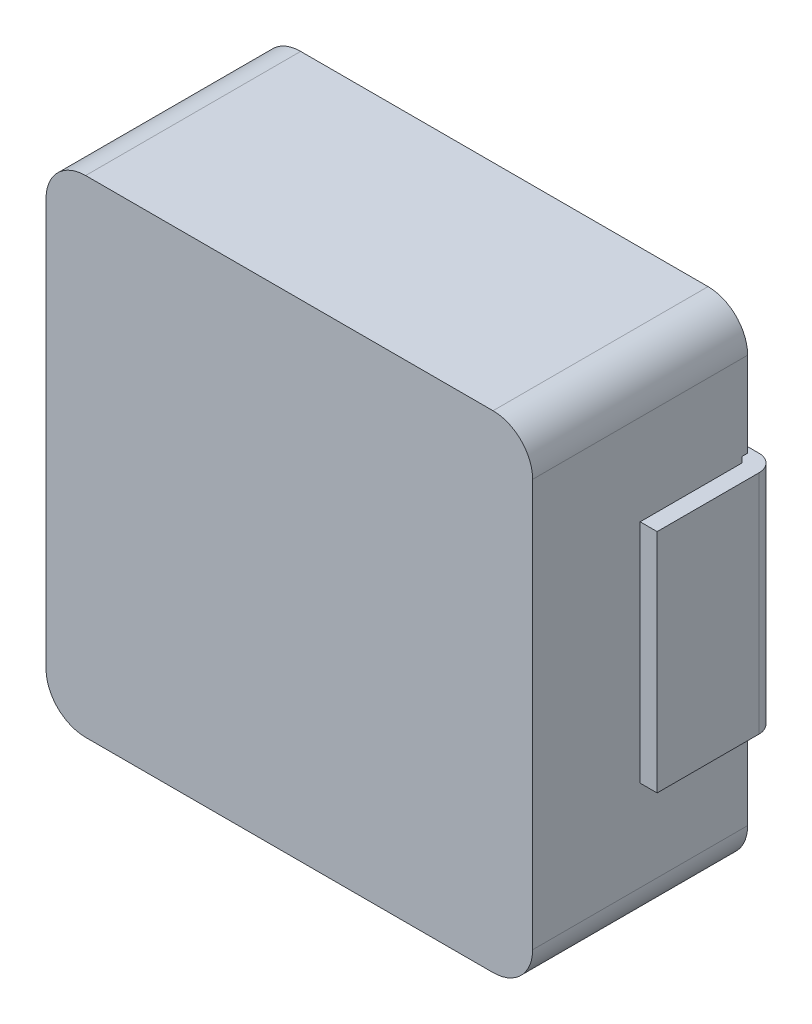
ISO-10303-21;
HEADER;
FILE_DESCRIPTION(('STEP AP214'),'2;1');
FILE_NAME('part.step','',(''),(''),'','','');
FILE_SCHEMA(('AUTOMOTIVE_DESIGN { 1 0 10303 214 1 1 1 1 }'));
ENDSEC;
DATA;
#1=APPLICATION_CONTEXT('core data for automotive mechanical design processes');
#2=APPLICATION_PROTOCOL_DEFINITION('international standard','automotive_design',2000,#1);
#3=PRODUCT_CONTEXT('',#1,'mechanical');
#4=PRODUCT('Part','Part','',(#3));
#5=PRODUCT_RELATED_PRODUCT_CATEGORY('part','',(#4));
#6=PRODUCT_DEFINITION_FORMATION('','',#4);
#7=PRODUCT_DEFINITION_CONTEXT('part definition',#1,'design');
#8=PRODUCT_DEFINITION('design','',#6,#7);
#9=PRODUCT_DEFINITION_SHAPE('','',#8);
#10=(LENGTH_UNIT() NAMED_UNIT(*) SI_UNIT(.MILLI.,.METRE.));
#11=(NAMED_UNIT(*) PLANE_ANGLE_UNIT() SI_UNIT($,.RADIAN.));
#12=(NAMED_UNIT(*) SI_UNIT($,.STERADIAN.) SOLID_ANGLE_UNIT());
#13=UNCERTAINTY_MEASURE_WITH_UNIT(LENGTH_MEASURE(1.E-05),#10,'distance_accuracy_value','');
#14=(GEOMETRIC_REPRESENTATION_CONTEXT(3) GLOBAL_UNCERTAINTY_ASSIGNED_CONTEXT((#13)) GLOBAL_UNIT_ASSIGNED_CONTEXT((#10,
#11,#12)) REPRESENTATION_CONTEXT('',''));
#15=CARTESIAN_POINT('',(0.,0.,0.));
#16=DIRECTION('',(0.,0.,1.));
#17=DIRECTION('',(1.,0.,0.));
#18=AXIS2_PLACEMENT_3D('',#15,#16,#17);
#19=CARTESIAN_POINT('',(2.15,2.15,1.9));
#20=DIRECTION('',(-1.,0.,0.));
#21=DIRECTION('',(0.,-1.,0.));
#22=AXIS2_PLACEMENT_3D('',#19,#20,#21);
#23=PLANE('',#22);
#24=DIRECTION('',(0.,0.,-1.));
#25=VECTOR('',#24,1.);
#26=CARTESIAN_POINT('',(2.15,1.,0.95));
#27=LINE('',#26,#25);
#28=CARTESIAN_POINT('',(2.15,1.,0.95));
#29=VERTEX_POINT('',#28);
#30=CARTESIAN_POINT('',(2.15,1.,0.05));
#31=VERTEX_POINT('',#30);
#32=EDGE_CURVE('E253',#29,#31,#27,.T.);
#33=ORIENTED_EDGE('',*,*,#32,.T.);
#34=DIRECTION('',(0.,-1.,0.));
#35=VECTOR('',#34,1.);
#36=CARTESIAN_POINT('',(2.15,-1.05,0.05));
#37=LINE('',#36,#35);
#38=CARTESIAN_POINT('',(2.15,1.05,0.05));
#39=VERTEX_POINT('',#38);
#40=EDGE_CURVE('E398',#39,#31,#37,.T.);
#41=ORIENTED_EDGE('',*,*,#40,.F.);
#42=DIRECTION('',(0.,0.,-1.));
#43=VECTOR('',#42,1.);
#44=CARTESIAN_POINT('',(2.15,1.05,0.05));
#45=LINE('',#44,#43);
#46=CARTESIAN_POINT('',(2.15,1.05,0.));
#47=VERTEX_POINT('',#46);
#48=EDGE_CURVE('E378',#39,#47,#45,.T.);
#49=ORIENTED_EDGE('',*,*,#48,.T.);
#50=DIRECTION('',(0.,1.,0.));
#51=VECTOR('',#50,1.);
#52=CARTESIAN_POINT('',(2.15,2.15,0.));
#53=LINE('',#52,#51);
#54=CARTESIAN_POINT('',(2.15,1.8,0.));
#55=VERTEX_POINT('',#54);
#56=EDGE_CURVE('E389',#47,#55,#53,.T.);
#57=ORIENTED_EDGE('',*,*,#56,.T.);
#58=DIRECTION('',(0.,0.,-1.));
#59=VECTOR('',#58,1.);
#60=CARTESIAN_POINT('',(2.15,1.8,1.9));
#61=LINE('',#60,#59);
#62=CARTESIAN_POINT('',(2.15,1.8,1.9));
#63=VERTEX_POINT('',#62);
#64=EDGE_CURVE('E495',#55,#63,#61,.F.);
#65=ORIENTED_EDGE('',*,*,#64,.T.);
#66=DIRECTION('',(0.,1.,0.));
#67=VECTOR('',#66,1.);
#68=CARTESIAN_POINT('',(2.15,2.15,1.9));
#69=LINE('',#68,#67);
#70=CARTESIAN_POINT('',(2.15,-1.8,1.9));
#71=VERTEX_POINT('',#70);
#72=EDGE_CURVE('E437',#71,#63,#69,.T.);
#73=ORIENTED_EDGE('',*,*,#72,.F.);
#74=DIRECTION('',(0.,0.,-1.));
#75=VECTOR('',#74,1.);
#76=CARTESIAN_POINT('',(2.15,-1.8,1.9));
#77=LINE('',#76,#75);
#78=CARTESIAN_POINT('',(2.15,-1.8,0.));
#79=VERTEX_POINT('',#78);
#80=EDGE_CURVE('E491',#71,#79,#77,.T.);
#81=ORIENTED_EDGE('',*,*,#80,.T.);
#82=CARTESIAN_POINT('',(2.15,-1.05,0.));
#83=VERTEX_POINT('',#82);
#84=EDGE_CURVE('E455',#79,#83,#53,.T.);
#85=ORIENTED_EDGE('',*,*,#84,.T.);
#86=DIRECTION('',(0.,0.,-1.));
#87=VECTOR('',#86,1.);
#88=CARTESIAN_POINT('',(2.15,-1.05,0.05));
#89=LINE('',#88,#87);
#90=CARTESIAN_POINT('',(2.15,-1.05,0.05));
#91=VERTEX_POINT('',#90);
#92=EDGE_CURVE('E415',#91,#83,#89,.T.);
#93=ORIENTED_EDGE('',*,*,#92,.F.);
#94=CARTESIAN_POINT('',(2.15,-1.,0.05));
#95=VERTEX_POINT('',#94);
#96=EDGE_CURVE('E403',#95,#91,#37,.T.);
#97=ORIENTED_EDGE('',*,*,#96,.F.);
#98=DIRECTION('',(0.,0.,-1.));
#99=VECTOR('',#98,1.);
#100=CARTESIAN_POINT('',(2.15,-1.,0.95));
#101=LINE('',#100,#99);
#102=CARTESIAN_POINT('',(2.15,-1.,0.95));
#103=VERTEX_POINT('',#102);
#104=EDGE_CURVE('E270',#103,#95,#101,.T.);
#105=ORIENTED_EDGE('',*,*,#104,.F.);
#106=DIRECTION('',(0.,-1.,0.));
#107=VECTOR('',#106,1.);
#108=CARTESIAN_POINT('',(2.15,-1.,0.95));
#109=LINE('',#108,#107);
#110=EDGE_CURVE('E257',#29,#103,#109,.T.);
#111=ORIENTED_EDGE('',*,*,#110,.F.);
#112=EDGE_LOOP('',(#33,#41,#49,#57,#65,#73,#81,#85,#93,#97,#105,#111));
#113=FACE_BOUND('',#112,.T.);
#114=ADVANCED_FACE('F39',(#113),#23,.F.);
#115=CARTESIAN_POINT('',(-2.15,2.15,1.9));
#116=DIRECTION('',(1.,0.,0.));
#117=DIRECTION('',(0.,1.,0.));
#118=AXIS2_PLACEMENT_3D('',#115,#116,#117);
#119=PLANE('',#118);
#120=DIRECTION('',(0.,0.,-1.));
#121=VECTOR('',#120,1.);
#122=CARTESIAN_POINT('',(-2.15,-1.,0.95));
#123=LINE('',#122,#121);
#124=CARTESIAN_POINT('',(-2.15,-1.,0.95));
#125=VERTEX_POINT('',#124);
#126=CARTESIAN_POINT('',(-2.15,-1.,0.05));
#127=VERTEX_POINT('',#126);
#128=EDGE_CURVE('E292',#125,#127,#123,.T.);
#129=ORIENTED_EDGE('',*,*,#128,.T.);
#130=DIRECTION('',(0.,1.,0.));
#131=VECTOR('',#130,1.);
#132=CARTESIAN_POINT('',(-2.15,-1.05,0.05));
#133=LINE('',#132,#131);
#134=CARTESIAN_POINT('',(-2.15,-1.05,0.05));
#135=VERTEX_POINT('',#134);
#136=EDGE_CURVE('E355',#135,#127,#133,.T.);
#137=ORIENTED_EDGE('',*,*,#136,.F.);
#138=DIRECTION('',(0.,0.,-1.));
#139=VECTOR('',#138,1.);
#140=CARTESIAN_POINT('',(-2.15,-1.05,0.05));
#141=LINE('',#140,#139);
#142=CARTESIAN_POINT('',(-2.15,-1.05,0.));
#143=VERTEX_POINT('',#142);
#144=EDGE_CURVE('E385',#135,#143,#141,.T.);
#145=ORIENTED_EDGE('',*,*,#144,.T.);
#146=DIRECTION('',(0.,-1.,0.));
#147=VECTOR('',#146,1.);
#148=CARTESIAN_POINT('',(-2.15,2.15,0.));
#149=LINE('',#148,#147);
#150=CARTESIAN_POINT('',(-2.15,-1.8,0.));
#151=VERTEX_POINT('',#150);
#152=EDGE_CURVE('E463',#143,#151,#149,.T.);
#153=ORIENTED_EDGE('',*,*,#152,.T.);
#154=DIRECTION('',(0.,0.,-1.));
#155=VECTOR('',#154,1.);
#156=CARTESIAN_POINT('',(-2.15,-1.8,1.9));
#157=LINE('',#156,#155);
#158=CARTESIAN_POINT('',(-2.15,-1.8,1.9));
#159=VERTEX_POINT('',#158);
#160=EDGE_CURVE('E510',#151,#159,#157,.F.);
#161=ORIENTED_EDGE('',*,*,#160,.T.);
#162=DIRECTION('',(0.,-1.,0.));
#163=VECTOR('',#162,1.);
#164=CARTESIAN_POINT('',(-2.15,2.15,1.9));
#165=LINE('',#164,#163);
#166=CARTESIAN_POINT('',(-2.15,1.8,1.9));
#167=VERTEX_POINT('',#166);
#168=EDGE_CURVE('E446',#167,#159,#165,.T.);
#169=ORIENTED_EDGE('',*,*,#168,.F.);
#170=DIRECTION('',(0.,0.,-1.));
#171=VECTOR('',#170,1.);
#172=CARTESIAN_POINT('',(-2.15,1.8,1.9));
#173=LINE('',#172,#171);
#174=CARTESIAN_POINT('',(-2.15,1.8,0.));
#175=VERTEX_POINT('',#174);
#176=EDGE_CURVE('E513',#167,#175,#173,.T.);
#177=ORIENTED_EDGE('',*,*,#176,.T.);
#178=CARTESIAN_POINT('',(-2.15,1.05,0.));
#179=VERTEX_POINT('',#178);
#180=EDGE_CURVE('E464',#175,#179,#149,.T.);
#181=ORIENTED_EDGE('',*,*,#180,.T.);
#182=DIRECTION('',(0.,0.,-1.));
#183=VECTOR('',#182,1.);
#184=CARTESIAN_POINT('',(-2.15,1.05,0.05));
#185=LINE('',#184,#183);
#186=CARTESIAN_POINT('',(-2.15,1.05,0.05));
#187=VERTEX_POINT('',#186);
#188=EDGE_CURVE('E372',#187,#179,#185,.T.);
#189=ORIENTED_EDGE('',*,*,#188,.F.);
#190=CARTESIAN_POINT('',(-2.15,1.,0.05));
#191=VERTEX_POINT('',#190);
#192=EDGE_CURVE('E360',#191,#187,#133,.T.);
#193=ORIENTED_EDGE('',*,*,#192,.F.);
#194=DIRECTION('',(0.,0.,-1.));
#195=VECTOR('',#194,1.);
#196=CARTESIAN_POINT('',(-2.15,1.,0.95));
#197=LINE('',#196,#195);
#198=CARTESIAN_POINT('',(-2.15,1.,0.95));
#199=VERTEX_POINT('',#198);
#200=EDGE_CURVE('E289',#199,#191,#197,.T.);
#201=ORIENTED_EDGE('',*,*,#200,.F.);
#202=DIRECTION('',(0.,1.,0.));
#203=VECTOR('',#202,1.);
#204=CARTESIAN_POINT('',(-2.15,-1.,0.95));
#205=LINE('',#204,#203);
#206=EDGE_CURVE('E282',#125,#199,#205,.T.);
#207=ORIENTED_EDGE('',*,*,#206,.F.);
#208=EDGE_LOOP('',(#129,#137,#145,#153,#161,#169,#177,#181,#189,#193,#201,#207));
#209=FACE_BOUND('',#208,.T.);
#210=ADVANCED_FACE('F606',(#209),#119,.F.);
#211=CARTESIAN_POINT('',(0.,0.,0.05));
#212=DIRECTION('',(0.,0.,1.));
#213=DIRECTION('',(1.,0.,0.));
#214=AXIS2_PLACEMENT_3D('',#211,#212,#213);
#215=PLANE('',#214);
#216=DIRECTION('',(1.,0.,0.));
#217=VECTOR('',#216,1.);
#218=CARTESIAN_POINT('',(1.3,1.,0.05));
#219=LINE('',#218,#217);
#220=CARTESIAN_POINT('',(1.3,1.,0.05));
#221=VERTEX_POINT('',#220);
#222=EDGE_CURVE('E301',#221,#31,#219,.T.);
#223=ORIENTED_EDGE('',*,*,#222,.F.);
#224=DIRECTION('',(0.,1.,0.));
#225=VECTOR('',#224,1.);
#226=CARTESIAN_POINT('',(1.3,-1.,0.05));
#227=LINE('',#226,#225);
#228=CARTESIAN_POINT('',(1.3,-1.,0.05));
#229=VERTEX_POINT('',#228);
#230=EDGE_CURVE('E295',#229,#221,#227,.T.);
#231=ORIENTED_EDGE('',*,*,#230,.F.);
#232=DIRECTION('',(-1.,0.,0.));
#233=VECTOR('',#232,1.);
#234=CARTESIAN_POINT('',(0.,-1.,0.05));
#235=LINE('',#234,#233);
#236=EDGE_CURVE('E528',#95,#229,#235,.T.);
#237=ORIENTED_EDGE('',*,*,#236,.F.);
#238=ORIENTED_EDGE('',*,*,#96,.T.);
#239=DIRECTION('',(-1.,0.,0.));
#240=VECTOR('',#239,1.);
#241=CARTESIAN_POINT('',(2.15,-1.05,0.05));
#242=LINE('',#241,#240);
#243=CARTESIAN_POINT('',(1.25,-1.05,0.05));
#244=VERTEX_POINT('',#243);
#245=EDGE_CURVE('E402',#91,#244,#242,.T.);
#246=ORIENTED_EDGE('',*,*,#245,.T.);
#247=DIRECTION('',(0.,1.,0.));
#248=VECTOR('',#247,1.);
#249=CARTESIAN_POINT('',(1.25,-1.05,0.05));
#250=LINE('',#249,#248);
#251=CARTESIAN_POINT('',(1.25,1.05,0.05));
#252=VERTEX_POINT('',#251);
#253=EDGE_CURVE('E407',#244,#252,#250,.T.);
#254=ORIENTED_EDGE('',*,*,#253,.T.);
#255=DIRECTION('',(1.,0.,0.));
#256=VECTOR('',#255,1.);
#257=CARTESIAN_POINT('',(2.15,1.05,0.05));
#258=LINE('',#257,#256);
#259=EDGE_CURVE('E411',#252,#39,#258,.T.);
#260=ORIENTED_EDGE('',*,*,#259,.T.);
#261=ORIENTED_EDGE('',*,*,#40,.T.);
#262=EDGE_LOOP('',(#223,#231,#237,#238,#246,#254,#260,#261));
#263=FACE_BOUND('',#262,.T.);
#264=ADVANCED_FACE('F558',(#263),#215,.F.);
#265=CARTESIAN_POINT('',(0.,0.,0.05));
#266=DIRECTION('',(0.,0.,-1.));
#267=DIRECTION('',(-1.,0.,0.));
#268=AXIS2_PLACEMENT_3D('',#265,#266,#267);
#269=PLANE('',#268);
#270=ORIENTED_EDGE('',*,*,#136,.T.);
#271=DIRECTION('',(-1.,0.,0.));
#272=VECTOR('',#271,1.);
#273=CARTESIAN_POINT('',(-1.3,-1.,0.05));
#274=LINE('',#273,#272);
#275=CARTESIAN_POINT('',(-1.3,-1.,0.05));
#276=VERTEX_POINT('',#275);
#277=EDGE_CURVE('E328',#276,#127,#274,.T.);
#278=ORIENTED_EDGE('',*,*,#277,.F.);
#279=DIRECTION('',(0.,-1.,0.));
#280=VECTOR('',#279,1.);
#281=CARTESIAN_POINT('',(-1.3,-1.,0.05));
#282=LINE('',#281,#280);
#283=CARTESIAN_POINT('',(-1.3,1.,0.05));
#284=VERTEX_POINT('',#283);
#285=EDGE_CURVE('E322',#284,#276,#282,.T.);
#286=ORIENTED_EDGE('',*,*,#285,.F.);
#287=DIRECTION('',(-1.,0.,0.));
#288=VECTOR('',#287,1.);
#289=CARTESIAN_POINT('',(0.,1.,0.05));
#290=LINE('',#289,#288);
#291=EDGE_CURVE('E524',#284,#191,#290,.T.);
#292=ORIENTED_EDGE('',*,*,#291,.T.);
#293=ORIENTED_EDGE('',*,*,#192,.T.);
#294=DIRECTION('',(1.,0.,0.));
#295=VECTOR('',#294,1.);
#296=CARTESIAN_POINT('',(-2.15,1.05,0.05));
#297=LINE('',#296,#295);
#298=CARTESIAN_POINT('',(-1.25,1.05,0.05));
#299=VERTEX_POINT('',#298);
#300=EDGE_CURVE('E359',#187,#299,#297,.T.);
#301=ORIENTED_EDGE('',*,*,#300,.T.);
#302=DIRECTION('',(0.,-1.,0.));
#303=VECTOR('',#302,1.);
#304=CARTESIAN_POINT('',(-1.25,-1.05,0.05));
#305=LINE('',#304,#303);
#306=CARTESIAN_POINT('',(-1.25,-1.05,0.05));
#307=VERTEX_POINT('',#306);
#308=EDGE_CURVE('E364',#299,#307,#305,.T.);
#309=ORIENTED_EDGE('',*,*,#308,.T.);
#310=DIRECTION('',(-1.,0.,0.));
#311=VECTOR('',#310,1.);
#312=CARTESIAN_POINT('',(-2.15,-1.05,0.05));
#313=LINE('',#312,#311);
#314=EDGE_CURVE('E368',#307,#135,#313,.T.);
#315=ORIENTED_EDGE('',*,*,#314,.T.);
#316=EDGE_LOOP('',(#270,#278,#286,#292,#293,#301,#309,#315));
#317=FACE_BOUND('',#316,.T.);
#318=ADVANCED_FACE('F624',(#317),#269,.T.);
#319=CARTESIAN_POINT('',(-2.15,2.15,1.9));
#320=DIRECTION('',(0.,-1.,0.));
#321=DIRECTION('',(0.,0.,-1.));
#322=AXIS2_PLACEMENT_3D('',#319,#320,#321);
#323=PLANE('',#322);
#324=DIRECTION('',(-1.,0.,0.));
#325=VECTOR('',#324,1.);
#326=CARTESIAN_POINT('',(-2.15,2.15,1.9));
#327=LINE('',#326,#325);
#328=CARTESIAN_POINT('',(1.8,2.15,1.9));
#329=VERTEX_POINT('',#328);
#330=CARTESIAN_POINT('',(-1.8,2.15,1.9));
#331=VERTEX_POINT('',#330);
#332=EDGE_CURVE('E441',#329,#331,#327,.T.);
#333=ORIENTED_EDGE('',*,*,#332,.F.);
#334=DIRECTION('',(0.,0.,-1.));
#335=VECTOR('',#334,1.);
#336=CARTESIAN_POINT('',(1.8,2.15,1.9));
#337=LINE('',#336,#335);
#338=CARTESIAN_POINT('',(1.8,2.15,0.));
#339=VERTEX_POINT('',#338);
#340=EDGE_CURVE('E473',#329,#339,#337,.T.);
#341=ORIENTED_EDGE('',*,*,#340,.T.);
#342=DIRECTION('',(-1.,0.,0.));
#343=VECTOR('',#342,1.);
#344=CARTESIAN_POINT('',(-2.15,2.15,0.));
#345=LINE('',#344,#343);
#346=CARTESIAN_POINT('',(-1.8,2.15,0.));
#347=VERTEX_POINT('',#346);
#348=EDGE_CURVE('E459',#339,#347,#345,.T.);
#349=ORIENTED_EDGE('',*,*,#348,.T.);
#350=DIRECTION('',(0.,0.,-1.));
#351=VECTOR('',#350,1.);
#352=CARTESIAN_POINT('',(-1.8,2.15,1.9));
#353=LINE('',#352,#351);
#354=EDGE_CURVE('E454',#347,#331,#353,.F.);
#355=ORIENTED_EDGE('',*,*,#354,.T.);
#356=EDGE_LOOP('',(#333,#341,#349,#355));
#357=FACE_BOUND('',#356,.T.);
#358=ADVANCED_FACE('F669',(#357),#323,.F.);
#359=CARTESIAN_POINT('',(-2.15,-2.15,1.9));
#360=DIRECTION('',(0.,1.,0.));
#361=DIRECTION('',(0.,0.,1.));
#362=AXIS2_PLACEMENT_3D('',#359,#360,#361);
#363=PLANE('',#362);
#364=DIRECTION('',(1.,0.,0.));
#365=VECTOR('',#364,1.);
#366=CARTESIAN_POINT('',(-2.15,-2.15,0.));
#367=LINE('',#366,#365);
#368=CARTESIAN_POINT('',(-1.8,-2.15,0.));
#369=VERTEX_POINT('',#368);
#370=CARTESIAN_POINT('',(1.8,-2.15,0.));
#371=VERTEX_POINT('',#370);
#372=EDGE_CURVE('E442',#369,#371,#367,.T.);
#373=ORIENTED_EDGE('',*,*,#372,.T.);
#374=DIRECTION('',(0.,0.,-1.));
#375=VECTOR('',#374,1.);
#376=CARTESIAN_POINT('',(1.8,-2.15,1.9));
#377=LINE('',#376,#375);
#378=CARTESIAN_POINT('',(1.8,-2.15,1.9));
#379=VERTEX_POINT('',#378);
#380=EDGE_CURVE('E521',#371,#379,#377,.F.);
#381=ORIENTED_EDGE('',*,*,#380,.T.);
#382=DIRECTION('',(1.,0.,0.));
#383=VECTOR('',#382,1.);
#384=CARTESIAN_POINT('',(-2.15,-2.15,1.9));
#385=LINE('',#384,#383);
#386=CARTESIAN_POINT('',(-1.8,-2.15,1.9));
#387=VERTEX_POINT('',#386);
#388=EDGE_CURVE('E450',#387,#379,#385,.T.);
#389=ORIENTED_EDGE('',*,*,#388,.F.);
#390=DIRECTION('',(0.,0.,-1.));
#391=VECTOR('',#390,1.);
#392=CARTESIAN_POINT('',(-1.8,-2.15,1.9));
#393=LINE('',#392,#391);
#394=EDGE_CURVE('E517',#387,#369,#393,.T.);
#395=ORIENTED_EDGE('',*,*,#394,.T.);
#396=EDGE_LOOP('',(#373,#381,#389,#395));
#397=FACE_BOUND('',#396,.T.);
#398=ADVANCED_FACE('F597',(#397),#363,.F.);
#399=CARTESIAN_POINT('',(0.,0.,1.9));
#400=DIRECTION('',(0.,0.,1.));
#401=DIRECTION('',(1.,0.,0.));
#402=AXIS2_PLACEMENT_3D('',#399,#400,#401);
#403=PLANE('',#402);
#404=ORIENTED_EDGE('',*,*,#72,.T.);
#405=CARTESIAN_POINT('',(1.8,1.8,1.9));
#406=DIRECTION('',(0.,0.,1.));
#407=DIRECTION('',(1.,0.,0.));
#408=AXIS2_PLACEMENT_3D('',#405,#406,#407);
#409=CIRCLE('',#408,0.35);
#410=EDGE_CURVE('E507',#63,#329,#409,.T.);
#411=ORIENTED_EDGE('',*,*,#410,.T.);
#412=ORIENTED_EDGE('',*,*,#332,.T.);
#413=CARTESIAN_POINT('',(-1.8,1.8,1.9));
#414=DIRECTION('',(0.,0.,1.));
#415=DIRECTION('',(1.,0.,0.));
#416=AXIS2_PLACEMENT_3D('',#413,#414,#415);
#417=CIRCLE('',#416,0.35);
#418=EDGE_CURVE('E504',#331,#167,#417,.T.);
#419=ORIENTED_EDGE('',*,*,#418,.T.);
#420=ORIENTED_EDGE('',*,*,#168,.T.);
#421=CARTESIAN_POINT('',(-1.8,-1.8,1.9));
#422=DIRECTION('',(0.,0.,1.));
#423=DIRECTION('',(1.,0.,0.));
#424=AXIS2_PLACEMENT_3D('',#421,#422,#423);
#425=CIRCLE('',#424,0.35);
#426=EDGE_CURVE('E498',#159,#387,#425,.T.);
#427=ORIENTED_EDGE('',*,*,#426,.T.);
#428=ORIENTED_EDGE('',*,*,#388,.T.);
#429=CARTESIAN_POINT('',(1.8,-1.8,1.9));
#430=DIRECTION('',(0.,0.,1.));
#431=DIRECTION('',(1.,0.,0.));
#432=AXIS2_PLACEMENT_3D('',#429,#430,#431);
#433=CIRCLE('',#432,0.35);
#434=EDGE_CURVE('E501',#379,#71,#433,.T.);
#435=ORIENTED_EDGE('',*,*,#434,.T.);
#436=EDGE_LOOP('',(#404,#411,#412,#419,#420,#427,#428,#435));
#437=FACE_BOUND('',#436,.T.);
#438=ADVANCED_FACE('F589',(#437),#403,.T.);
#439=CARTESIAN_POINT('',(0.,0.,0.));
#440=DIRECTION('',(0.,0.,1.));
#441=DIRECTION('',(1.,0.,0.));
#442=AXIS2_PLACEMENT_3D('',#439,#440,#441);
#443=PLANE('',#442);
#444=ORIENTED_EDGE('',*,*,#152,.F.);
#445=DIRECTION('',(-1.,0.,0.));
#446=VECTOR('',#445,1.);
#447=CARTESIAN_POINT('',(-2.15,-1.05,0.));
#448=LINE('',#447,#446);
#449=CARTESIAN_POINT('',(-1.25,-1.05,0.));
#450=VERTEX_POINT('',#449);
#451=EDGE_CURVE('E382',#450,#143,#448,.T.);
#452=ORIENTED_EDGE('',*,*,#451,.F.);
#453=DIRECTION('',(0.,-1.,0.));
#454=VECTOR('',#453,1.);
#455=CARTESIAN_POINT('',(-1.25,-1.05,0.));
#456=LINE('',#455,#454);
#457=CARTESIAN_POINT('',(-1.25,1.05,0.));
#458=VERTEX_POINT('',#457);
#459=EDGE_CURVE('E377',#458,#450,#456,.T.);
#460=ORIENTED_EDGE('',*,*,#459,.F.);
#461=DIRECTION('',(1.,0.,0.));
#462=VECTOR('',#461,1.);
#463=CARTESIAN_POINT('',(-2.15,1.05,0.));
#464=LINE('',#463,#462);
#465=EDGE_CURVE('E373',#179,#458,#464,.T.);
#466=ORIENTED_EDGE('',*,*,#465,.F.);
#467=ORIENTED_EDGE('',*,*,#180,.F.);
#468=CARTESIAN_POINT('',(-1.8,1.8,0.));
#469=DIRECTION('',(0.,0.,1.));
#470=DIRECTION('',(1.,0.,0.));
#471=AXIS2_PLACEMENT_3D('',#468,#469,#470);
#472=CIRCLE('',#471,0.35);
#473=EDGE_CURVE('E484',#175,#347,#472,.F.);
#474=ORIENTED_EDGE('',*,*,#473,.T.);
#475=ORIENTED_EDGE('',*,*,#348,.F.);
#476=CARTESIAN_POINT('',(1.8,1.8,0.));
#477=DIRECTION('',(0.,0.,1.));
#478=DIRECTION('',(1.,0.,0.));
#479=AXIS2_PLACEMENT_3D('',#476,#477,#478);
#480=CIRCLE('',#479,0.35);
#481=EDGE_CURVE('E487',#339,#55,#480,.F.);
#482=ORIENTED_EDGE('',*,*,#481,.T.);
#483=ORIENTED_EDGE('',*,*,#56,.F.);
#484=DIRECTION('',(1.,0.,0.));
#485=VECTOR('',#484,1.);
#486=CARTESIAN_POINT('',(2.15,1.05,0.));
#487=LINE('',#486,#485);
#488=CARTESIAN_POINT('',(1.25,1.05,0.));
#489=VERTEX_POINT('',#488);
#490=EDGE_CURVE('E423',#489,#47,#487,.T.);
#491=ORIENTED_EDGE('',*,*,#490,.F.);
#492=DIRECTION('',(0.,1.,0.));
#493=VECTOR('',#492,1.);
#494=CARTESIAN_POINT('',(1.25,-1.05,0.));
#495=LINE('',#494,#493);
#496=CARTESIAN_POINT('',(1.25,-1.05,0.));
#497=VERTEX_POINT('',#496);
#498=EDGE_CURVE('E419',#497,#489,#495,.T.);
#499=ORIENTED_EDGE('',*,*,#498,.F.);
#500=DIRECTION('',(-1.,0.,0.));
#501=VECTOR('',#500,1.);
#502=CARTESIAN_POINT('',(2.15,-1.05,0.));
#503=LINE('',#502,#501);
#504=EDGE_CURVE('E354',#83,#497,#503,.T.);
#505=ORIENTED_EDGE('',*,*,#504,.F.);
#506=ORIENTED_EDGE('',*,*,#84,.F.);
#507=CARTESIAN_POINT('',(1.8,-1.8,0.));
#508=DIRECTION('',(0.,0.,1.));
#509=DIRECTION('',(1.,0.,0.));
#510=AXIS2_PLACEMENT_3D('',#507,#508,#509);
#511=CIRCLE('',#510,0.35);
#512=EDGE_CURVE('E481',#79,#371,#511,.F.);
#513=ORIENTED_EDGE('',*,*,#512,.T.);
#514=ORIENTED_EDGE('',*,*,#372,.F.);
#515=CARTESIAN_POINT('',(-1.8,-1.8,0.));
#516=DIRECTION('',(0.,0.,1.));
#517=DIRECTION('',(1.,0.,0.));
#518=AXIS2_PLACEMENT_3D('',#515,#516,#517);
#519=CIRCLE('',#518,0.35);
#520=EDGE_CURVE('E477',#369,#151,#519,.F.);
#521=ORIENTED_EDGE('',*,*,#520,.T.);
#522=EDGE_LOOP('',(#444,#452,#460,#466,#467,#474,#475,#482,#483,#491,#499,#505,#506,#513,#514,#521));
#523=FACE_BOUND('',#522,.T.);
#524=ADVANCED_FACE('F571',(#523),#443,.F.);
#525=CARTESIAN_POINT('',(1.8,1.8,1.9));
#526=DIRECTION('',(0.,0.,-1.));
#527=DIRECTION('',(-1.,0.,0.));
#528=AXIS2_PLACEMENT_3D('',#525,#526,#527);
#529=CYLINDRICAL_SURFACE('',#528,0.35);
#530=ORIENTED_EDGE('',*,*,#410,.F.);
#531=ORIENTED_EDGE('',*,*,#64,.F.);
#532=ORIENTED_EDGE('',*,*,#481,.F.);
#533=ORIENTED_EDGE('',*,*,#340,.F.);
#534=EDGE_LOOP('',(#530,#531,#532,#533));
#535=FACE_BOUND('',#534,.T.);
#536=ADVANCED_FACE('F587',(#535),#529,.T.);
#537=CARTESIAN_POINT('',(-1.8,1.8,1.9));
#538=DIRECTION('',(0.,0.,-1.));
#539=DIRECTION('',(-1.,0.,0.));
#540=AXIS2_PLACEMENT_3D('',#537,#538,#539);
#541=CYLINDRICAL_SURFACE('',#540,0.35);
#542=ORIENTED_EDGE('',*,*,#418,.F.);
#543=ORIENTED_EDGE('',*,*,#354,.F.);
#544=ORIENTED_EDGE('',*,*,#473,.F.);
#545=ORIENTED_EDGE('',*,*,#176,.F.);
#546=EDGE_LOOP('',(#542,#543,#544,#545));
#547=FACE_BOUND('',#546,.T.);
#548=ADVANCED_FACE('F611',(#547),#541,.T.);
#549=CARTESIAN_POINT('',(1.8,-1.8,1.9));
#550=DIRECTION('',(0.,0.,-1.));
#551=DIRECTION('',(-1.,0.,0.));
#552=AXIS2_PLACEMENT_3D('',#549,#550,#551);
#553=CYLINDRICAL_SURFACE('',#552,0.35);
#554=ORIENTED_EDGE('',*,*,#434,.F.);
#555=ORIENTED_EDGE('',*,*,#380,.F.);
#556=ORIENTED_EDGE('',*,*,#512,.F.);
#557=ORIENTED_EDGE('',*,*,#80,.F.);
#558=EDGE_LOOP('',(#554,#555,#556,#557));
#559=FACE_BOUND('',#558,.T.);
#560=ADVANCED_FACE('F595',(#559),#553,.T.);
#561=CARTESIAN_POINT('',(-1.8,-1.8,1.9));
#562=DIRECTION('',(0.,0.,-1.));
#563=DIRECTION('',(-1.,0.,0.));
#564=AXIS2_PLACEMENT_3D('',#561,#562,#563);
#565=CYLINDRICAL_SURFACE('',#564,0.35);
#566=ORIENTED_EDGE('',*,*,#426,.F.);
#567=ORIENTED_EDGE('',*,*,#160,.F.);
#568=ORIENTED_EDGE('',*,*,#520,.F.);
#569=ORIENTED_EDGE('',*,*,#394,.F.);
#570=EDGE_LOOP('',(#566,#567,#568,#569));
#571=FACE_BOUND('',#570,.T.);
#572=ADVANCED_FACE('F603',(#571),#565,.T.);
#573=CARTESIAN_POINT('',(2.15,1.05,0.05));
#574=DIRECTION('',(0.,1.,0.));
#575=DIRECTION('',(0.,0.,1.));
#576=AXIS2_PLACEMENT_3D('',#573,#574,#575);
#577=PLANE('',#576);
#578=ORIENTED_EDGE('',*,*,#490,.T.);
#579=ORIENTED_EDGE('',*,*,#48,.F.);
#580=ORIENTED_EDGE('',*,*,#259,.F.);
#581=DIRECTION('',(0.,0.,-1.));
#582=VECTOR('',#581,1.);
#583=CARTESIAN_POINT('',(1.25,1.05,0.05));
#584=LINE('',#583,#582);
#585=EDGE_CURVE('E429',#252,#489,#584,.T.);
#586=ORIENTED_EDGE('',*,*,#585,.T.);
#587=EDGE_LOOP('',(#578,#579,#580,#586));
#588=FACE_BOUND('',#587,.T.);
#589=ADVANCED_FACE('F581',(#588),#577,.F.);
#590=CARTESIAN_POINT('',(1.25,-1.05,0.05));
#591=DIRECTION('',(-1.,0.,0.));
#592=DIRECTION('',(0.,0.,1.));
#593=AXIS2_PLACEMENT_3D('',#590,#591,#592);
#594=PLANE('',#593);
#595=ORIENTED_EDGE('',*,*,#498,.T.);
#596=ORIENTED_EDGE('',*,*,#585,.F.);
#597=ORIENTED_EDGE('',*,*,#253,.F.);
#598=DIRECTION('',(0.,0.,-1.));
#599=VECTOR('',#598,1.);
#600=CARTESIAN_POINT('',(1.25,-1.05,0.05));
#601=LINE('',#600,#599);
#602=EDGE_CURVE('E432',#244,#497,#601,.T.);
#603=ORIENTED_EDGE('',*,*,#602,.T.);
#604=EDGE_LOOP('',(#595,#596,#597,#603));
#605=FACE_BOUND('',#604,.T.);
#606=ADVANCED_FACE('F577',(#605),#594,.F.);
#607=CARTESIAN_POINT('',(2.15,-1.05,0.05));
#608=DIRECTION('',(0.,-1.,0.));
#609=DIRECTION('',(0.,0.,-1.));
#610=AXIS2_PLACEMENT_3D('',#607,#608,#609);
#611=PLANE('',#610);
#612=ORIENTED_EDGE('',*,*,#504,.T.);
#613=ORIENTED_EDGE('',*,*,#602,.F.);
#614=ORIENTED_EDGE('',*,*,#245,.F.);
#615=ORIENTED_EDGE('',*,*,#92,.T.);
#616=EDGE_LOOP('',(#612,#613,#614,#615));
#617=FACE_BOUND('',#616,.T.);
#618=ADVANCED_FACE('F563',(#617),#611,.F.);
#619=CARTESIAN_POINT('',(-2.15,-1.05,0.05));
#620=DIRECTION('',(0.,-1.,0.));
#621=DIRECTION('',(0.,0.,-1.));
#622=AXIS2_PLACEMENT_3D('',#619,#620,#621);
#623=PLANE('',#622);
#624=ORIENTED_EDGE('',*,*,#451,.T.);
#625=ORIENTED_EDGE('',*,*,#144,.F.);
#626=ORIENTED_EDGE('',*,*,#314,.F.);
#627=DIRECTION('',(0.,0.,-1.));
#628=VECTOR('',#627,1.);
#629=CARTESIAN_POINT('',(-1.25,-1.05,0.05));
#630=LINE('',#629,#628);
#631=EDGE_CURVE('E390',#307,#450,#630,.T.);
#632=ORIENTED_EDGE('',*,*,#631,.T.);
#633=EDGE_LOOP('',(#624,#625,#626,#632));
#634=FACE_BOUND('',#633,.T.);
#635=ADVANCED_FACE('F650',(#634),#623,.F.);
#636=CARTESIAN_POINT('',(-1.25,-1.05,0.05));
#637=DIRECTION('',(1.,0.,0.));
#638=DIRECTION('',(0.,0.,-1.));
#639=AXIS2_PLACEMENT_3D('',#636,#637,#638);
#640=PLANE('',#639);
#641=ORIENTED_EDGE('',*,*,#459,.T.);
#642=ORIENTED_EDGE('',*,*,#631,.F.);
#643=ORIENTED_EDGE('',*,*,#308,.F.);
#644=DIRECTION('',(0.,0.,-1.));
#645=VECTOR('',#644,1.);
#646=CARTESIAN_POINT('',(-1.25,1.05,0.05));
#647=LINE('',#646,#645);
#648=EDGE_CURVE('E393',#299,#458,#647,.T.);
#649=ORIENTED_EDGE('',*,*,#648,.T.);
#650=EDGE_LOOP('',(#641,#642,#643,#649));
#651=FACE_BOUND('',#650,.T.);
#652=ADVANCED_FACE('F652',(#651),#640,.F.);
#653=CARTESIAN_POINT('',(-2.15,1.05,0.05));
#654=DIRECTION('',(0.,1.,0.));
#655=DIRECTION('',(0.,0.,1.));
#656=AXIS2_PLACEMENT_3D('',#653,#654,#655);
#657=PLANE('',#656);
#658=ORIENTED_EDGE('',*,*,#465,.T.);
#659=ORIENTED_EDGE('',*,*,#648,.F.);
#660=ORIENTED_EDGE('',*,*,#300,.F.);
#661=ORIENTED_EDGE('',*,*,#188,.T.);
#662=EDGE_LOOP('',(#658,#659,#660,#661));
#663=FACE_BOUND('',#662,.T.);
#664=ADVANCED_FACE('F617',(#663),#657,.F.);
#665=CARTESIAN_POINT('',(-1.3,-1.,-0.1));
#666=DIRECTION('',(-1.,0.,0.));
#667=DIRECTION('',(0.,0.,1.));
#668=AXIS2_PLACEMENT_3D('',#665,#666,#667);
#669=PLANE('',#668);
#670=ORIENTED_EDGE('',*,*,#285,.T.);
#671=DIRECTION('',(0.,0.,1.));
#672=VECTOR('',#671,1.);
#673=CARTESIAN_POINT('',(-1.3,-1.,-0.1));
#674=LINE('',#673,#672);
#675=CARTESIAN_POINT('',(-1.3,-1.,-0.1));
#676=VERTEX_POINT('',#675);
#677=EDGE_CURVE('E351',#676,#276,#674,.T.);
#678=ORIENTED_EDGE('',*,*,#677,.F.);
#679=DIRECTION('',(0.,-1.,0.));
#680=VECTOR('',#679,1.);
#681=CARTESIAN_POINT('',(-1.3,-1.,-0.1));
#682=LINE('',#681,#680);
#683=CARTESIAN_POINT('',(-1.3,1.,-0.1));
#684=VERTEX_POINT('',#683);
#685=EDGE_CURVE('E323',#684,#676,#682,.T.);
#686=ORIENTED_EDGE('',*,*,#685,.F.);
#687=DIRECTION('',(0.,0.,1.));
#688=VECTOR('',#687,1.);
#689=CARTESIAN_POINT('',(-1.3,1.,-0.1));
#690=LINE('',#689,#688);
#691=EDGE_CURVE('E335',#684,#284,#690,.T.);
#692=ORIENTED_EDGE('',*,*,#691,.T.);
#693=EDGE_LOOP('',(#670,#678,#686,#692));
#694=FACE_BOUND('',#693,.T.);
#695=ADVANCED_FACE('F632',(#694),#669,.F.);
#696=CARTESIAN_POINT('',(-1.3,-1.,-0.1));
#697=DIRECTION('',(0.,1.,0.));
#698=DIRECTION('',(0.,0.,1.));
#699=AXIS2_PLACEMENT_3D('',#696,#697,#698);
#700=PLANE('',#699);
#701=DIRECTION('',(0.,0.,1.));
#702=VECTOR('',#701,1.);
#703=CARTESIAN_POINT('',(-2.3,-1.,-0.1));
#704=LINE('',#703,#702);
#705=CARTESIAN_POINT('',(-2.3,-1.,0.05));
#706=VERTEX_POINT('',#705);
#707=CARTESIAN_POINT('',(-2.3,-1.,0.95));
#708=VERTEX_POINT('',#707);
#709=EDGE_CURVE('E348',#706,#708,#704,.T.);
#710=ORIENTED_EDGE('',*,*,#709,.F.);
#711=CARTESIAN_POINT('',(-2.15,-1.,0.05));
#712=DIRECTION('',(0.,1.,0.));
#713=DIRECTION('',(0.,0.,1.));
#714=AXIS2_PLACEMENT_3D('',#711,#712,#713);
#715=CIRCLE('',#714,0.15);
#716=CARTESIAN_POINT('',(-2.15,-1.,-0.1));
#717=VERTEX_POINT('',#716);
#718=EDGE_CURVE('E11',#706,#717,#715,.F.);
#719=ORIENTED_EDGE('',*,*,#718,.T.);
#720=DIRECTION('',(-1.,0.,0.));
#721=VECTOR('',#720,1.);
#722=CARTESIAN_POINT('',(-1.3,-1.,-0.1));
#723=LINE('',#722,#721);
#724=EDGE_CURVE('E327',#676,#717,#723,.T.);
#725=ORIENTED_EDGE('',*,*,#724,.F.);
#726=ORIENTED_EDGE('',*,*,#677,.T.);
#727=ORIENTED_EDGE('',*,*,#277,.T.);
#728=ORIENTED_EDGE('',*,*,#128,.F.);
#729=DIRECTION('',(1.,0.,0.));
#730=VECTOR('',#729,1.);
#731=CARTESIAN_POINT('',(-2.3,-1.,0.95));
#732=LINE('',#731,#730);
#733=EDGE_CURVE('E279',#708,#125,#732,.T.);
#734=ORIENTED_EDGE('',*,*,#733,.F.);
#735=EDGE_LOOP('',(#710,#719,#725,#726,#727,#728,#734));
#736=FACE_BOUND('',#735,.T.);
#737=ADVANCED_FACE('F640',(#736),#700,.F.);
#738=CARTESIAN_POINT('',(-2.3,-1.,-0.1));
#739=DIRECTION('',(1.,0.,0.));
#740=DIRECTION('',(0.,0.,-1.));
#741=AXIS2_PLACEMENT_3D('',#738,#739,#740);
#742=PLANE('',#741);
#743=DIRECTION('',(0.,0.,1.));
#744=VECTOR('',#743,1.);
#745=CARTESIAN_POINT('',(-2.3,1.,-0.1));
#746=LINE('',#745,#744);
#747=CARTESIAN_POINT('',(-2.3,1.,0.05));
#748=VERTEX_POINT('',#747);
#749=CARTESIAN_POINT('',(-2.3,1.,0.95));
#750=VERTEX_POINT('',#749);
#751=EDGE_CURVE('E345',#748,#750,#746,.T.);
#752=ORIENTED_EDGE('',*,*,#751,.F.);
#753=DIRECTION('',(0.,1.,0.));
#754=VECTOR('',#753,1.);
#755=CARTESIAN_POINT('',(-2.3,-1.,0.05));
#756=LINE('',#755,#754);
#757=EDGE_CURVE('E48',#748,#706,#756,.F.);
#758=ORIENTED_EDGE('',*,*,#757,.T.);
#759=ORIENTED_EDGE('',*,*,#709,.T.);
#760=DIRECTION('',(0.,-1.,0.));
#761=VECTOR('',#760,1.);
#762=CARTESIAN_POINT('',(-2.3,-1.,0.95));
#763=LINE('',#762,#761);
#764=EDGE_CURVE('E275',#750,#708,#763,.T.);
#765=ORIENTED_EDGE('',*,*,#764,.F.);
#766=EDGE_LOOP('',(#752,#758,#759,#765));
#767=FACE_BOUND('',#766,.T.);
#768=ADVANCED_FACE('F644',(#767),#742,.F.);
#769=CARTESIAN_POINT('',(-1.3,1.,-0.1));
#770=DIRECTION('',(0.,-1.,0.));
#771=DIRECTION('',(0.,0.,-1.));
#772=AXIS2_PLACEMENT_3D('',#769,#770,#771);
#773=PLANE('',#772);
#774=DIRECTION('',(1.,0.,0.));
#775=VECTOR('',#774,1.);
#776=CARTESIAN_POINT('',(-1.3,1.,-0.1));
#777=LINE('',#776,#775);
#778=CARTESIAN_POINT('',(-2.15,1.,-0.1));
#779=VERTEX_POINT('',#778);
#780=EDGE_CURVE('E332',#779,#684,#777,.T.);
#781=ORIENTED_EDGE('',*,*,#780,.F.);
#782=CARTESIAN_POINT('',(-2.15,1.,0.05));
#783=DIRECTION('',(0.,-1.,0.));
#784=DIRECTION('',(0.,0.,-1.));
#785=AXIS2_PLACEMENT_3D('',#782,#783,#784);
#786=CIRCLE('',#785,0.15);
#787=EDGE_CURVE('E62',#779,#748,#786,.F.);
#788=ORIENTED_EDGE('',*,*,#787,.T.);
#789=ORIENTED_EDGE('',*,*,#751,.T.);
#790=DIRECTION('',(-1.,0.,0.));
#791=VECTOR('',#790,1.);
#792=CARTESIAN_POINT('',(-2.3,1.,0.95));
#793=LINE('',#792,#791);
#794=EDGE_CURVE('E285',#199,#750,#793,.T.);
#795=ORIENTED_EDGE('',*,*,#794,.F.);
#796=ORIENTED_EDGE('',*,*,#200,.T.);
#797=ORIENTED_EDGE('',*,*,#291,.F.);
#798=ORIENTED_EDGE('',*,*,#691,.F.);
#799=EDGE_LOOP('',(#781,#788,#789,#795,#796,#797,#798));
#800=FACE_BOUND('',#799,.T.);
#801=ADVANCED_FACE('F628',(#800),#773,.F.);
#802=CARTESIAN_POINT('',(0.,0.,-0.1));
#803=DIRECTION('',(0.,0.,1.));
#804=DIRECTION('',(1.,0.,0.));
#805=AXIS2_PLACEMENT_3D('',#802,#803,#804);
#806=PLANE('',#805);
#807=ORIENTED_EDGE('',*,*,#724,.T.);
#808=DIRECTION('',(0.,1.,0.));
#809=VECTOR('',#808,1.);
#810=CARTESIAN_POINT('',(-2.15,0.,-0.1));
#811=LINE('',#810,#809);
#812=EDGE_CURVE('E544',#717,#779,#811,.T.);
#813=ORIENTED_EDGE('',*,*,#812,.T.);
#814=ORIENTED_EDGE('',*,*,#780,.T.);
#815=ORIENTED_EDGE('',*,*,#685,.T.);
#816=EDGE_LOOP('',(#807,#813,#814,#815));
#817=FACE_BOUND('',#816,.T.);
#818=ADVANCED_FACE('F635',(#817),#806,.F.);
#819=CARTESIAN_POINT('',(1.3,-1.,-0.1));
#820=DIRECTION('',(1.,0.,0.));
#821=DIRECTION('',(0.,0.,-1.));
#822=AXIS2_PLACEMENT_3D('',#819,#820,#821);
#823=PLANE('',#822);
#824=ORIENTED_EDGE('',*,*,#230,.T.);
#825=DIRECTION('',(0.,0.,1.));
#826=VECTOR('',#825,1.);
#827=CARTESIAN_POINT('',(1.3,1.,-0.1));
#828=LINE('',#827,#826);
#829=CARTESIAN_POINT('',(1.3,1.,-0.1));
#830=VERTEX_POINT('',#829);
#831=EDGE_CURVE('E246',#830,#221,#828,.T.);
#832=ORIENTED_EDGE('',*,*,#831,.F.);
#833=DIRECTION('',(0.,1.,0.));
#834=VECTOR('',#833,1.);
#835=CARTESIAN_POINT('',(1.3,-1.,-0.1));
#836=LINE('',#835,#834);
#837=CARTESIAN_POINT('',(1.3,-1.,-0.1));
#838=VERTEX_POINT('',#837);
#839=EDGE_CURVE('E296',#838,#830,#836,.T.);
#840=ORIENTED_EDGE('',*,*,#839,.F.);
#841=DIRECTION('',(0.,0.,1.));
#842=VECTOR('',#841,1.);
#843=CARTESIAN_POINT('',(1.3,-1.,-0.1));
#844=LINE('',#843,#842);
#845=EDGE_CURVE('E308',#838,#229,#844,.T.);
#846=ORIENTED_EDGE('',*,*,#845,.T.);
#847=EDGE_LOOP('',(#824,#832,#840,#846));
#848=FACE_BOUND('',#847,.T.);
#849=ADVANCED_FACE('F693',(#848),#823,.F.);
#850=CARTESIAN_POINT('',(1.3,1.,-0.1));
#851=DIRECTION('',(0.,-1.,0.));
#852=DIRECTION('',(0.,0.,-1.));
#853=AXIS2_PLACEMENT_3D('',#850,#851,#852);
#854=PLANE('',#853);
#855=DIRECTION('',(0.,0.,1.));
#856=VECTOR('',#855,1.);
#857=CARTESIAN_POINT('',(2.3,1.,-0.1));
#858=LINE('',#857,#856);
#859=CARTESIAN_POINT('',(2.3,1.,0.05));
#860=VERTEX_POINT('',#859);
#861=CARTESIAN_POINT('',(2.3,1.,0.95));
#862=VERTEX_POINT('',#861);
#863=EDGE_CURVE('E235',#860,#862,#858,.T.);
#864=ORIENTED_EDGE('',*,*,#863,.F.);
#865=CARTESIAN_POINT('',(2.15,1.,0.05));
#866=DIRECTION('',(0.,-1.,0.));
#867=DIRECTION('',(0.,0.,-1.));
#868=AXIS2_PLACEMENT_3D('',#865,#866,#867);
#869=CIRCLE('',#868,0.15);
#870=CARTESIAN_POINT('',(2.15,1.,-0.1));
#871=VERTEX_POINT('',#870);
#872=EDGE_CURVE('E541',#860,#871,#869,.F.);
#873=ORIENTED_EDGE('',*,*,#872,.T.);
#874=DIRECTION('',(1.,0.,0.));
#875=VECTOR('',#874,1.);
#876=CARTESIAN_POINT('',(1.3,1.,-0.1));
#877=LINE('',#876,#875);
#878=EDGE_CURVE('E300',#830,#871,#877,.T.);
#879=ORIENTED_EDGE('',*,*,#878,.F.);
#880=ORIENTED_EDGE('',*,*,#831,.T.);
#881=ORIENTED_EDGE('',*,*,#222,.T.);
#882=ORIENTED_EDGE('',*,*,#32,.F.);
#883=DIRECTION('',(-1.,0.,0.));
#884=VECTOR('',#883,1.);
#885=CARTESIAN_POINT('',(2.3,1.,0.95));
#886=LINE('',#885,#884);
#887=EDGE_CURVE('E250',#862,#29,#886,.T.);
#888=ORIENTED_EDGE('',*,*,#887,.F.);
#889=EDGE_LOOP('',(#864,#873,#879,#880,#881,#882,#888));
#890=FACE_BOUND('',#889,.T.);
#891=ADVANCED_FACE('F251',(#890),#854,.F.);
#892=CARTESIAN_POINT('',(2.3,-1.,-0.1));
#893=DIRECTION('',(-1.,0.,0.));
#894=DIRECTION('',(0.,0.,1.));
#895=AXIS2_PLACEMENT_3D('',#892,#893,#894);
#896=PLANE('',#895);
#897=DIRECTION('',(0.,0.,1.));
#898=VECTOR('',#897,1.);
#899=CARTESIAN_POINT('',(2.3,-1.,-0.1));
#900=LINE('',#899,#898);
#901=CARTESIAN_POINT('',(2.3,-1.,0.05));
#902=VERTEX_POINT('',#901);
#903=CARTESIAN_POINT('',(2.3,-1.,0.95));
#904=VERTEX_POINT('',#903);
#905=EDGE_CURVE('E247',#902,#904,#900,.T.);
#906=ORIENTED_EDGE('',*,*,#905,.F.);
#907=DIRECTION('',(0.,-1.,0.));
#908=VECTOR('',#907,1.);
#909=CARTESIAN_POINT('',(2.3,1.,0.05));
#910=LINE('',#909,#908);
#911=EDGE_CURVE('E242',#902,#860,#910,.F.);
#912=ORIENTED_EDGE('',*,*,#911,.T.);
#913=ORIENTED_EDGE('',*,*,#863,.T.);
#914=DIRECTION('',(0.,1.,0.));
#915=VECTOR('',#914,1.);
#916=CARTESIAN_POINT('',(2.3,-1.,0.95));
#917=LINE('',#916,#915);
#918=EDGE_CURVE('E240',#904,#862,#917,.T.);
#919=ORIENTED_EDGE('',*,*,#918,.F.);
#920=EDGE_LOOP('',(#906,#912,#913,#919));
#921=FACE_BOUND('',#920,.T.);
#922=ADVANCED_FACE('F238',(#921),#896,.F.);
#923=CARTESIAN_POINT('',(1.3,-1.,-0.1));
#924=DIRECTION('',(0.,1.,0.));
#925=DIRECTION('',(-1.,0.,0.));
#926=AXIS2_PLACEMENT_3D('',#923,#924,#925);
#927=PLANE('',#926);
#928=DIRECTION('',(-1.,0.,0.));
#929=VECTOR('',#928,1.);
#930=CARTESIAN_POINT('',(1.3,-1.,-0.1));
#931=LINE('',#930,#929);
#932=CARTESIAN_POINT('',(2.15,-1.,-0.1));
#933=VERTEX_POINT('',#932);
#934=EDGE_CURVE('E305',#933,#838,#931,.T.);
#935=ORIENTED_EDGE('',*,*,#934,.F.);
#936=CARTESIAN_POINT('',(2.15,-1.,0.05));
#937=DIRECTION('',(0.,1.,0.));
#938=DIRECTION('',(-1.,0.,0.));
#939=AXIS2_PLACEMENT_3D('',#936,#937,#938);
#940=CIRCLE('',#939,0.15);
#941=EDGE_CURVE('E536',#933,#902,#940,.F.);
#942=ORIENTED_EDGE('',*,*,#941,.T.);
#943=ORIENTED_EDGE('',*,*,#905,.T.);
#944=DIRECTION('',(1.,0.,0.));
#945=VECTOR('',#944,1.);
#946=CARTESIAN_POINT('',(2.3,-1.,0.95));
#947=LINE('',#946,#945);
#948=EDGE_CURVE('E262',#103,#904,#947,.T.);
#949=ORIENTED_EDGE('',*,*,#948,.F.);
#950=ORIENTED_EDGE('',*,*,#104,.T.);
#951=ORIENTED_EDGE('',*,*,#236,.T.);
#952=ORIENTED_EDGE('',*,*,#845,.F.);
#953=EDGE_LOOP('',(#935,#942,#943,#949,#950,#951,#952));
#954=FACE_BOUND('',#953,.T.);
#955=ADVANCED_FACE('F695',(#954),#927,.F.);
#956=CARTESIAN_POINT('',(0.,0.,-0.1));
#957=DIRECTION('',(0.,0.,-1.));
#958=DIRECTION('',(-1.,0.,0.));
#959=AXIS2_PLACEMENT_3D('',#956,#957,#958);
#960=PLANE('',#959);
#961=ORIENTED_EDGE('',*,*,#878,.T.);
#962=DIRECTION('',(0.,-1.,0.));
#963=VECTOR('',#962,1.);
#964=CARTESIAN_POINT('',(2.15,-1.,-0.1));
#965=LINE('',#964,#963);
#966=EDGE_CURVE('E532',#871,#933,#965,.T.);
#967=ORIENTED_EDGE('',*,*,#966,.T.);
#968=ORIENTED_EDGE('',*,*,#934,.T.);
#969=ORIENTED_EDGE('',*,*,#839,.T.);
#970=EDGE_LOOP('',(#961,#967,#968,#969));
#971=FACE_BOUND('',#970,.T.);
#972=ADVANCED_FACE('F687',(#971),#960,.T.);
#973=CARTESIAN_POINT('',(0.,0.,0.95));
#974=DIRECTION('',(0.,0.,-1.));
#975=DIRECTION('',(-1.,0.,0.));
#976=AXIS2_PLACEMENT_3D('',#973,#974,#975);
#977=PLANE('',#976);
#978=ORIENTED_EDGE('',*,*,#764,.T.);
#979=ORIENTED_EDGE('',*,*,#733,.T.);
#980=ORIENTED_EDGE('',*,*,#206,.T.);
#981=ORIENTED_EDGE('',*,*,#794,.T.);
#982=EDGE_LOOP('',(#978,#979,#980,#981));
#983=FACE_BOUND('',#982,.T.);
#984=ADVANCED_FACE('F646',(#983),#977,.F.);
#985=CARTESIAN_POINT('',(0.,0.,0.95));
#986=DIRECTION('',(0.,0.,1.));
#987=DIRECTION('',(1.,0.,0.));
#988=AXIS2_PLACEMENT_3D('',#985,#986,#987);
#989=PLANE('',#988);
#990=ORIENTED_EDGE('',*,*,#918,.T.);
#991=ORIENTED_EDGE('',*,*,#887,.T.);
#992=ORIENTED_EDGE('',*,*,#110,.T.);
#993=ORIENTED_EDGE('',*,*,#948,.T.);
#994=EDGE_LOOP('',(#990,#991,#992,#993));
#995=FACE_BOUND('',#994,.T.);
#996=ADVANCED_FACE('F260',(#995),#989,.T.);
#997=CARTESIAN_POINT('',(2.15,0.,0.05));
#998=DIRECTION('',(0.,1.,0.));
#999=DIRECTION('',(0.,0.,1.));
#1000=AXIS2_PLACEMENT_3D('',#997,#998,#999);
#1001=CYLINDRICAL_SURFACE('',#1000,0.15);
#1002=ORIENTED_EDGE('',*,*,#872,.F.);
#1003=ORIENTED_EDGE('',*,*,#911,.F.);
#1004=ORIENTED_EDGE('',*,*,#941,.F.);
#1005=ORIENTED_EDGE('',*,*,#966,.F.);
#1006=EDGE_LOOP('',(#1002,#1003,#1004,#1005));
#1007=FACE_BOUND('',#1006,.T.);
#1008=ADVANCED_FACE('F677',(#1007),#1001,.T.);
#1009=CARTESIAN_POINT('',(-2.15,0.,0.05));
#1010=DIRECTION('',(0.,1.,0.));
#1011=DIRECTION('',(0.,0.,1.));
#1012=AXIS2_PLACEMENT_3D('',#1009,#1010,#1011);
#1013=CYLINDRICAL_SURFACE('',#1012,0.15);
#1014=ORIENTED_EDGE('',*,*,#718,.F.);
#1015=ORIENTED_EDGE('',*,*,#757,.F.);
#1016=ORIENTED_EDGE('',*,*,#787,.F.);
#1017=ORIENTED_EDGE('',*,*,#812,.F.);
#1018=EDGE_LOOP('',(#1014,#1015,#1016,#1017));
#1019=FACE_BOUND('',#1018,.T.);
#1020=ADVANCED_FACE('F41',(#1019),#1013,.T.);
#1021=CLOSED_SHELL('',(#114,#210,#264,#318,#358,#398,#438,#524,#536,#548,#560,#572,#589,#606,
#618,#635,#652,#664,#695,#737,#768,#801,#818,#849,#891,#922,#955,#972,#984,#996,#1008,#1020));
#1022=MANIFOLD_SOLID_BREP('B2',#1021);
#1023=ADVANCED_BREP_SHAPE_REPRESENTATION('',(#18,#1022),#14);
#1024=SHAPE_DEFINITION_REPRESENTATION(#9,#1023);
ENDSEC;
END-ISO-10303-21;
